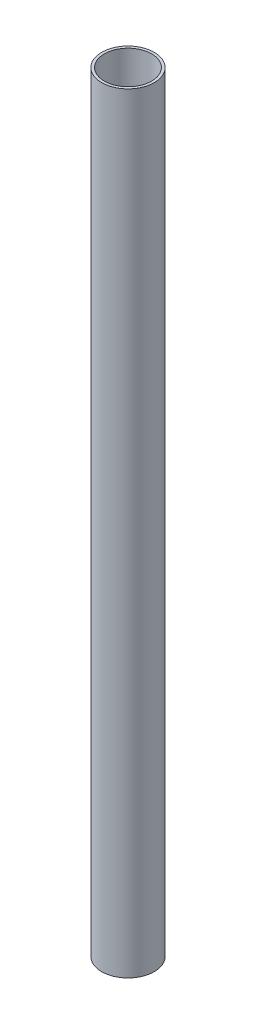
ISO-10303-21;
HEADER;
FILE_DESCRIPTION(('STEP AP214'),'2;1');
FILE_NAME('part.step','',(''),(''),'','','');
FILE_SCHEMA(('AUTOMOTIVE_DESIGN { 1 0 10303 214 1 1 1 1 }'));
ENDSEC;
DATA;
#1=APPLICATION_CONTEXT('core data for automotive mechanical design processes');
#2=APPLICATION_PROTOCOL_DEFINITION('international standard','automotive_design',2000,#1);
#3=PRODUCT_CONTEXT('',#1,'mechanical');
#4=PRODUCT('Part','Part','',(#3));
#5=PRODUCT_RELATED_PRODUCT_CATEGORY('part','',(#4));
#6=PRODUCT_DEFINITION_FORMATION('','',#4);
#7=PRODUCT_DEFINITION_CONTEXT('part definition',#1,'design');
#8=PRODUCT_DEFINITION('design','',#6,#7);
#9=PRODUCT_DEFINITION_SHAPE('','',#8);
#10=(LENGTH_UNIT() NAMED_UNIT(*) SI_UNIT(.MILLI.,.METRE.));
#11=(NAMED_UNIT(*) PLANE_ANGLE_UNIT() SI_UNIT($,.RADIAN.));
#12=(NAMED_UNIT(*) SI_UNIT($,.STERADIAN.) SOLID_ANGLE_UNIT());
#13=UNCERTAINTY_MEASURE_WITH_UNIT(LENGTH_MEASURE(1.E-05),#10,'distance_accuracy_value','');
#14=(GEOMETRIC_REPRESENTATION_CONTEXT(3) GLOBAL_UNCERTAINTY_ASSIGNED_CONTEXT((#13)) GLOBAL_UNIT_ASSIGNED_CONTEXT((#10,
#11,#12)) REPRESENTATION_CONTEXT('',''));
#15=CARTESIAN_POINT('',(0.,0.,0.));
#16=DIRECTION('',(0.,0.,1.));
#17=DIRECTION('',(1.,0.,0.));
#18=AXIS2_PLACEMENT_3D('',#15,#16,#17);
#19=CARTESIAN_POINT('',(0.,586.,0.));
#20=DIRECTION('',(0.,1.,0.));
#21=DIRECTION('',(0.,0.,1.));
#22=AXIS2_PLACEMENT_3D('',#19,#20,#21);
#23=PLANE('',#22);
#24=CARTESIAN_POINT('',(0.,586.,0.));
#25=DIRECTION('',(0.,1.,0.));
#26=DIRECTION('',(0.,0.,1.));
#27=AXIS2_PLACEMENT_3D('',#24,#25,#26);
#28=CIRCLE('',#27,20.);
#29=CARTESIAN_POINT('',(0.,586.,20.));
#30=VERTEX_POINT('',#29);
#31=EDGE_CURVE('E10',#30,#30,#28,.T.);
#32=ORIENTED_EDGE('',*,*,#31,.T.);
#33=EDGE_LOOP('',(#32));
#34=FACE_BOUND('',#33,.T.);
#35=CARTESIAN_POINT('',(0.,586.,0.));
#36=DIRECTION('',(0.,1.,0.));
#37=DIRECTION('',(0.,0.,1.));
#38=AXIS2_PLACEMENT_3D('',#35,#36,#37);
#39=CIRCLE('',#38,18.);
#40=CARTESIAN_POINT('',(0.,586.,18.));
#41=VERTEX_POINT('',#40);
#42=EDGE_CURVE('E42',#41,#41,#39,.T.);
#43=ORIENTED_EDGE('',*,*,#42,.F.);
#44=EDGE_LOOP('',(#43));
#45=FACE_BOUND('',#44,.T.);
#46=ADVANCED_FACE('F31',(#34,#45),#23,.T.);
#47=CARTESIAN_POINT('',(0.,0.,0.));
#48=DIRECTION('',(0.,1.,0.));
#49=DIRECTION('',(0.,0.,1.));
#50=AXIS2_PLACEMENT_3D('',#47,#48,#49);
#51=PLANE('',#50);
#52=CARTESIAN_POINT('',(0.,0.,0.));
#53=DIRECTION('',(0.,1.,0.));
#54=DIRECTION('',(0.,0.,1.));
#55=AXIS2_PLACEMENT_3D('',#52,#53,#54);
#56=CIRCLE('',#55,20.);
#57=CARTESIAN_POINT('',(0.,0.,20.));
#58=VERTEX_POINT('',#57);
#59=EDGE_CURVE('E35',#58,#58,#56,.T.);
#60=ORIENTED_EDGE('',*,*,#59,.F.);
#61=EDGE_LOOP('',(#60));
#62=FACE_BOUND('',#61,.T.);
#63=CARTESIAN_POINT('',(0.,0.,0.));
#64=DIRECTION('',(0.,1.,0.));
#65=DIRECTION('',(0.,0.,1.));
#66=AXIS2_PLACEMENT_3D('',#63,#64,#65);
#67=CIRCLE('',#66,18.);
#68=CARTESIAN_POINT('',(0.,0.,18.));
#69=VERTEX_POINT('',#68);
#70=EDGE_CURVE('E44',#69,#69,#67,.T.);
#71=ORIENTED_EDGE('',*,*,#70,.T.);
#72=EDGE_LOOP('',(#71));
#73=FACE_BOUND('',#72,.T.);
#74=ADVANCED_FACE('F54',(#62,#73),#51,.F.);
#75=CARTESIAN_POINT('',(0.,586.,0.));
#76=DIRECTION('',(0.,-1.,0.));
#77=DIRECTION('',(0.,0.,-1.));
#78=AXIS2_PLACEMENT_3D('',#75,#76,#77);
#79=CYLINDRICAL_SURFACE('',#78,20.);
#80=ORIENTED_EDGE('',*,*,#31,.F.);
#81=EDGE_LOOP('',(#80));
#82=FACE_BOUND('',#81,.T.);
#83=ORIENTED_EDGE('',*,*,#59,.T.);
#84=EDGE_LOOP('',(#83));
#85=FACE_BOUND('',#84,.T.);
#86=ADVANCED_FACE('F33',(#82,#85),#79,.T.);
#87=CARTESIAN_POINT('',(0.,586.,0.));
#88=DIRECTION('',(0.,-1.,0.));
#89=DIRECTION('',(0.,0.,-1.));
#90=AXIS2_PLACEMENT_3D('',#87,#88,#89);
#91=CYLINDRICAL_SURFACE('',#90,18.);
#92=ORIENTED_EDGE('',*,*,#42,.T.);
#93=EDGE_LOOP('',(#92));
#94=FACE_BOUND('',#93,.T.);
#95=ORIENTED_EDGE('',*,*,#70,.F.);
#96=EDGE_LOOP('',(#95));
#97=FACE_BOUND('',#96,.T.);
#98=ADVANCED_FACE('F50',(#94,#97),#91,.F.);
#99=CLOSED_SHELL('',(#46,#74,#86,#98));
#100=MANIFOLD_SOLID_BREP('B2',#99);
#101=ADVANCED_BREP_SHAPE_REPRESENTATION('',(#18,#100),#14);
#102=SHAPE_DEFINITION_REPRESENTATION(#9,#101);
ENDSEC;
END-ISO-10303-21;
